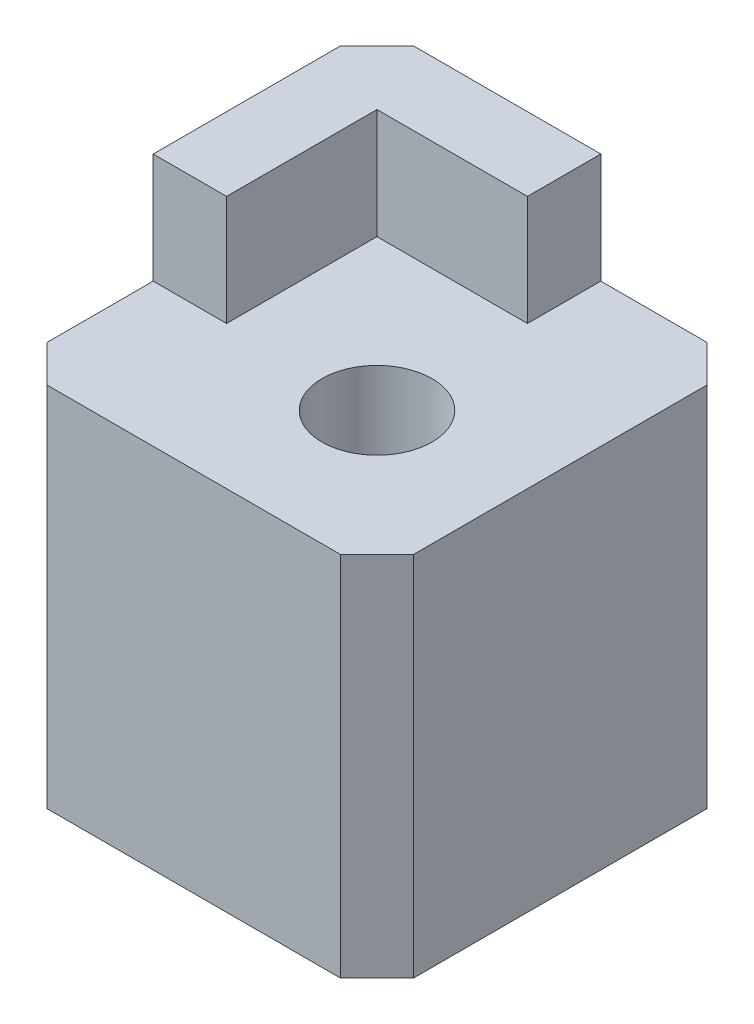
ISO-10303-21;
HEADER;
FILE_DESCRIPTION(('STEP AP214'),'2;1');
FILE_NAME('part.step','',(''),(''),'','','');
FILE_SCHEMA(('AUTOMOTIVE_DESIGN { 1 0 10303 214 1 1 1 1 }'));
ENDSEC;
DATA;
#1=APPLICATION_CONTEXT('core data for automotive mechanical design processes');
#2=APPLICATION_PROTOCOL_DEFINITION('international standard','automotive_design',2000,#1);
#3=PRODUCT_CONTEXT('',#1,'mechanical');
#4=PRODUCT('Part','Part','',(#3));
#5=PRODUCT_RELATED_PRODUCT_CATEGORY('part','',(#4));
#6=PRODUCT_DEFINITION_FORMATION('','',#4);
#7=PRODUCT_DEFINITION_CONTEXT('part definition',#1,'design');
#8=PRODUCT_DEFINITION('design','',#6,#7);
#9=PRODUCT_DEFINITION_SHAPE('','',#8);
#10=(LENGTH_UNIT() NAMED_UNIT(*) SI_UNIT(.MILLI.,.METRE.));
#11=(NAMED_UNIT(*) PLANE_ANGLE_UNIT() SI_UNIT($,.RADIAN.));
#12=(NAMED_UNIT(*) SI_UNIT($,.STERADIAN.) SOLID_ANGLE_UNIT());
#13=UNCERTAINTY_MEASURE_WITH_UNIT(LENGTH_MEASURE(1.E-05),#10,'distance_accuracy_value','');
#14=(GEOMETRIC_REPRESENTATION_CONTEXT(3) GLOBAL_UNCERTAINTY_ASSIGNED_CONTEXT((#13)) GLOBAL_UNIT_ASSIGNED_CONTEXT((#10,
#11,#12)) REPRESENTATION_CONTEXT('',''));
#15=CARTESIAN_POINT('',(0.,0.,0.));
#16=DIRECTION('',(0.,0.,1.));
#17=DIRECTION('',(1.,0.,0.));
#18=AXIS2_PLACEMENT_3D('',#15,#16,#17);
#19=CARTESIAN_POINT('',(0.,0.,0.));
#20=DIRECTION('',(0.,1.,0.));
#21=DIRECTION('',(0.,0.,1.));
#22=AXIS2_PLACEMENT_3D('',#19,#20,#21);
#23=PLANE('',#22);
#24=CARTESIAN_POINT('',(0.,0.,0.));
#25=DIRECTION('',(0.,1.,0.));
#26=DIRECTION('',(0.,0.,1.));
#27=AXIS2_PLACEMENT_3D('',#24,#25,#26);
#28=CIRCLE('',#27,1.5);
#29=CARTESIAN_POINT('',(0.,0.,1.5));
#30=VERTEX_POINT('',#29);
#31=EDGE_CURVE('E210',#30,#30,#28,.T.);
#32=ORIENTED_EDGE('',*,*,#31,.F.);
#33=EDGE_LOOP('',(#32));
#34=FACE_BOUND('',#33,.T.);
#35=DIRECTION('',(0.,0.,1.));
#36=VECTOR('',#35,1.);
#37=CARTESIAN_POINT('',(3.9,0.,-6.1));
#38=LINE('',#37,#36);
#39=CARTESIAN_POINT('',(3.9,0.,-5.1));
#40=VERTEX_POINT('',#39);
#41=CARTESIAN_POINT('',(3.9,0.,2.9));
#42=VERTEX_POINT('',#41);
#43=EDGE_CURVE('E270',#40,#42,#38,.T.);
#44=ORIENTED_EDGE('',*,*,#43,.F.);
#45=DIRECTION('',(0.707106781186549,0.,0.707106781186546));
#46=VECTOR('',#45,1.);
#47=CARTESIAN_POINT('',(4.49999999999999,0.,-4.50000000000001));
#48=LINE('',#47,#46);
#49=CARTESIAN_POINT('',(2.89999999999999,0.,-6.1));
#50=VERTEX_POINT('',#49);
#51=EDGE_CURVE('E313',#40,#50,#48,.F.);
#52=ORIENTED_EDGE('',*,*,#51,.T.);
#53=DIRECTION('',(1.,0.,0.));
#54=VECTOR('',#53,1.);
#55=CARTESIAN_POINT('',(-6.1,0.,-6.1));
#56=LINE('',#55,#54);
#57=CARTESIAN_POINT('',(0.,0.,-6.1));
#58=VERTEX_POINT('',#57);
#59=EDGE_CURVE('E252',#58,#50,#56,.T.);
#60=ORIENTED_EDGE('',*,*,#59,.F.);
#61=DIRECTION('',(0.,0.,1.));
#62=VECTOR('',#61,1.);
#63=CARTESIAN_POINT('',(0.,0.,0.));
#64=LINE('',#63,#62);
#65=CARTESIAN_POINT('',(0.,0.,-4.1));
#66=VERTEX_POINT('',#65);
#67=EDGE_CURVE('E190',#58,#66,#64,.T.);
#68=ORIENTED_EDGE('',*,*,#67,.T.);
#69=DIRECTION('',(-1.,0.,0.));
#70=VECTOR('',#69,1.);
#71=CARTESIAN_POINT('',(0.,0.,-4.1));
#72=LINE('',#71,#70);
#73=CARTESIAN_POINT('',(-4.1,0.,-4.1));
#74=VERTEX_POINT('',#73);
#75=EDGE_CURVE('E201',#66,#74,#72,.T.);
#76=ORIENTED_EDGE('',*,*,#75,.T.);
#77=DIRECTION('',(0.,0.,1.));
#78=VECTOR('',#77,1.);
#79=CARTESIAN_POINT('',(-4.1,0.,0.));
#80=LINE('',#79,#78);
#81=CARTESIAN_POINT('',(-4.1,0.,0.));
#82=VERTEX_POINT('',#81);
#83=EDGE_CURVE('E207',#74,#82,#80,.T.);
#84=ORIENTED_EDGE('',*,*,#83,.T.);
#85=DIRECTION('',(-1.,0.,0.));
#86=VECTOR('',#85,1.);
#87=CARTESIAN_POINT('',(0.,0.,0.));
#88=LINE('',#87,#86);
#89=CARTESIAN_POINT('',(-6.1,0.,0.));
#90=VERTEX_POINT('',#89);
#91=EDGE_CURVE('E229',#82,#90,#88,.T.);
#92=ORIENTED_EDGE('',*,*,#91,.T.);
#93=DIRECTION('',(0.,0.,1.));
#94=VECTOR('',#93,1.);
#95=CARTESIAN_POINT('',(-6.1,0.,-6.1));
#96=LINE('',#95,#94);
#97=CARTESIAN_POINT('',(-6.1,0.,2.9));
#98=VERTEX_POINT('',#97);
#99=EDGE_CURVE('E193',#90,#98,#96,.T.);
#100=ORIENTED_EDGE('',*,*,#99,.T.);
#101=DIRECTION('',(-0.707106781186549,0.,-0.707106781186546));
#102=VECTOR('',#101,1.);
#103=CARTESIAN_POINT('',(-4.49999999999999,0.,4.5));
#104=LINE('',#103,#102);
#105=CARTESIAN_POINT('',(-5.09999999999999,0.,3.9));
#106=VERTEX_POINT('',#105);
#107=EDGE_CURVE('E86',#98,#106,#104,.F.);
#108=ORIENTED_EDGE('',*,*,#107,.T.);
#109=DIRECTION('',(1.,0.,0.));
#110=VECTOR('',#109,1.);
#111=CARTESIAN_POINT('',(-6.1,0.,3.9));
#112=LINE('',#111,#110);
#113=CARTESIAN_POINT('',(2.9,0.,3.9));
#114=VERTEX_POINT('',#113);
#115=EDGE_CURVE('E267',#106,#114,#112,.T.);
#116=ORIENTED_EDGE('',*,*,#115,.T.);
#117=DIRECTION('',(0.707106781186546,0.,-0.707106781186549));
#118=VECTOR('',#117,1.);
#119=CARTESIAN_POINT('',(3.40000000000001,0.,3.39999999999999));
#120=LINE('',#119,#118);
#121=EDGE_CURVE('E75',#114,#42,#120,.T.);
#122=ORIENTED_EDGE('',*,*,#121,.T.);
#123=EDGE_LOOP('',(#44,#52,#60,#68,#76,#84,#92,#100,#108,#116,#122));
#124=FACE_BOUND('',#123,.T.);
#125=ADVANCED_FACE('F56',(#34,#124),#23,.T.);
#126=CARTESIAN_POINT('',(-6.1,-10.,-6.1));
#127=DIRECTION('',(-1.,0.,0.));
#128=DIRECTION('',(0.,0.,1.));
#129=AXIS2_PLACEMENT_3D('',#126,#127,#128);
#130=PLANE('',#129);
#131=DIRECTION('',(0.,0.,-1.));
#132=VECTOR('',#131,1.);
#133=CARTESIAN_POINT('',(-6.1,3.,0.));
#134=LINE('',#133,#132);
#135=CARTESIAN_POINT('',(-6.1,3.,0.));
#136=VERTEX_POINT('',#135);
#137=CARTESIAN_POINT('',(-6.1,3.,-5.09999999999999));
#138=VERTEX_POINT('',#137);
#139=EDGE_CURVE('E182',#136,#138,#134,.T.);
#140=ORIENTED_EDGE('',*,*,#139,.T.);
#141=DIRECTION('',(0.,-1.,0.));
#142=VECTOR('',#141,1.);
#143=CARTESIAN_POINT('',(-6.1,-10.,-5.09999999999999));
#144=LINE('',#143,#142);
#145=CARTESIAN_POINT('',(-6.1,-10.,-5.09999999999999));
#146=VERTEX_POINT('',#145);
#147=EDGE_CURVE('E287',#138,#146,#144,.T.);
#148=ORIENTED_EDGE('',*,*,#147,.T.);
#149=DIRECTION('',(0.,0.,1.));
#150=VECTOR('',#149,1.);
#151=CARTESIAN_POINT('',(-6.1,-10.,-6.1));
#152=LINE('',#151,#150);
#153=CARTESIAN_POINT('',(-6.1,-10.,2.9));
#154=VERTEX_POINT('',#153);
#155=EDGE_CURVE('E247',#146,#154,#152,.T.);
#156=ORIENTED_EDGE('',*,*,#155,.T.);
#157=DIRECTION('',(0.,1.,0.));
#158=VECTOR('',#157,1.);
#159=CARTESIAN_POINT('',(-6.1,-10.,2.9));
#160=LINE('',#159,#158);
#161=EDGE_CURVE('E283',#154,#98,#160,.T.);
#162=ORIENTED_EDGE('',*,*,#161,.T.);
#163=ORIENTED_EDGE('',*,*,#99,.F.);
#164=DIRECTION('',(0.,-1.,0.));
#165=VECTOR('',#164,1.);
#166=CARTESIAN_POINT('',(-6.1,3.,0.));
#167=LINE('',#166,#165);
#168=EDGE_CURVE('E194',#136,#90,#167,.T.);
#169=ORIENTED_EDGE('',*,*,#168,.F.);
#170=EDGE_LOOP('',(#140,#148,#156,#162,#163,#169));
#171=FACE_BOUND('',#170,.T.);
#172=ADVANCED_FACE('F343',(#171),#130,.T.);
#173=CARTESIAN_POINT('',(-6.1,-10.,-6.1));
#174=DIRECTION('',(0.,0.,1.));
#175=DIRECTION('',(1.,0.,0.));
#176=AXIS2_PLACEMENT_3D('',#173,#174,#175);
#177=PLANE('',#176);
#178=DIRECTION('',(1.,0.,0.));
#179=VECTOR('',#178,1.);
#180=CARTESIAN_POINT('',(-6.1,-10.,-6.1));
#181=LINE('',#180,#179);
#182=CARTESIAN_POINT('',(-5.1,-10.,-6.1));
#183=VERTEX_POINT('',#182);
#184=CARTESIAN_POINT('',(2.89999999999999,-10.,-6.1));
#185=VERTEX_POINT('',#184);
#186=EDGE_CURVE('E260',#183,#185,#181,.T.);
#187=ORIENTED_EDGE('',*,*,#186,.F.);
#188=DIRECTION('',(0.,1.,0.));
#189=VECTOR('',#188,1.);
#190=CARTESIAN_POINT('',(-5.1,3.,-6.1));
#191=LINE('',#190,#189);
#192=CARTESIAN_POINT('',(-5.1,3.,-6.1));
#193=VERTEX_POINT('',#192);
#194=EDGE_CURVE('E178',#183,#193,#191,.T.);
#195=ORIENTED_EDGE('',*,*,#194,.T.);
#196=DIRECTION('',(1.,0.,0.));
#197=VECTOR('',#196,1.);
#198=CARTESIAN_POINT('',(0.,3.,-6.1));
#199=LINE('',#198,#197);
#200=CARTESIAN_POINT('',(0.,3.,-6.1));
#201=VERTEX_POINT('',#200);
#202=EDGE_CURVE('E170',#193,#201,#199,.T.);
#203=ORIENTED_EDGE('',*,*,#202,.T.);
#204=DIRECTION('',(0.,-1.,0.));
#205=VECTOR('',#204,1.);
#206=CARTESIAN_POINT('',(0.,3.,-6.1));
#207=LINE('',#206,#205);
#208=EDGE_CURVE('E175',#201,#58,#207,.T.);
#209=ORIENTED_EDGE('',*,*,#208,.T.);
#210=ORIENTED_EDGE('',*,*,#59,.T.);
#211=DIRECTION('',(0.,-1.,0.));
#212=VECTOR('',#211,1.);
#213=CARTESIAN_POINT('',(2.89999999999999,-10.,-6.1));
#214=LINE('',#213,#212);
#215=EDGE_CURVE('E264',#50,#185,#214,.T.);
#216=ORIENTED_EDGE('',*,*,#215,.T.);
#217=EDGE_LOOP('',(#187,#195,#203,#209,#210,#216));
#218=FACE_BOUND('',#217,.T.);
#219=ADVANCED_FACE('F173',(#218),#177,.F.);
#220=CARTESIAN_POINT('',(3.9,-10.,-6.1));
#221=DIRECTION('',(-1.,0.,0.));
#222=DIRECTION('',(0.,0.,1.));
#223=AXIS2_PLACEMENT_3D('',#220,#221,#222);
#224=PLANE('',#223);
#225=DIRECTION('',(0.,0.,1.));
#226=VECTOR('',#225,1.);
#227=CARTESIAN_POINT('',(3.9,-10.,-6.1));
#228=LINE('',#227,#226);
#229=CARTESIAN_POINT('',(3.9,-10.,-5.1));
#230=VERTEX_POINT('',#229);
#231=CARTESIAN_POINT('',(3.9,-10.,2.9));
#232=VERTEX_POINT('',#231);
#233=EDGE_CURVE('E256',#230,#232,#228,.T.);
#234=ORIENTED_EDGE('',*,*,#233,.F.);
#235=DIRECTION('',(0.,1.,0.));
#236=VECTOR('',#235,1.);
#237=CARTESIAN_POINT('',(3.9,-10.,-5.1));
#238=LINE('',#237,#236);
#239=EDGE_CURVE('E305',#230,#40,#238,.T.);
#240=ORIENTED_EDGE('',*,*,#239,.T.);
#241=ORIENTED_EDGE('',*,*,#43,.T.);
#242=DIRECTION('',(0.,-1.,0.));
#243=VECTOR('',#242,1.);
#244=CARTESIAN_POINT('',(3.9,-10.,2.9));
#245=LINE('',#244,#243);
#246=EDGE_CURVE('E302',#42,#232,#245,.T.);
#247=ORIENTED_EDGE('',*,*,#246,.T.);
#248=EDGE_LOOP('',(#234,#240,#241,#247));
#249=FACE_BOUND('',#248,.T.);
#250=ADVANCED_FACE('F326',(#249),#224,.F.);
#251=CARTESIAN_POINT('',(-6.1,-10.,3.9));
#252=DIRECTION('',(0.,0.,1.));
#253=DIRECTION('',(1.,0.,0.));
#254=AXIS2_PLACEMENT_3D('',#251,#252,#253);
#255=PLANE('',#254);
#256=ORIENTED_EDGE('',*,*,#115,.F.);
#257=DIRECTION('',(0.,-1.,0.));
#258=VECTOR('',#257,1.);
#259=CARTESIAN_POINT('',(-5.09999999999999,-10.,3.9));
#260=LINE('',#259,#258);
#261=CARTESIAN_POINT('',(-5.09999999999999,-10.,3.9));
#262=VERTEX_POINT('',#261);
#263=EDGE_CURVE('E11',#106,#262,#260,.T.);
#264=ORIENTED_EDGE('',*,*,#263,.T.);
#265=DIRECTION('',(1.,0.,0.));
#266=VECTOR('',#265,1.);
#267=CARTESIAN_POINT('',(-6.1,-10.,3.9));
#268=LINE('',#267,#266);
#269=CARTESIAN_POINT('',(2.9,-10.,3.9));
#270=VERTEX_POINT('',#269);
#271=EDGE_CURVE('E251',#262,#270,#268,.T.);
#272=ORIENTED_EDGE('',*,*,#271,.T.);
#273=DIRECTION('',(0.,1.,0.));
#274=VECTOR('',#273,1.);
#275=CARTESIAN_POINT('',(2.9,0.,3.9));
#276=LINE('',#275,#274);
#277=EDGE_CURVE('E66',#270,#114,#276,.T.);
#278=ORIENTED_EDGE('',*,*,#277,.T.);
#279=EDGE_LOOP('',(#256,#264,#272,#278));
#280=FACE_BOUND('',#279,.T.);
#281=ADVANCED_FACE('F319',(#280),#255,.T.);
#282=CARTESIAN_POINT('',(0.,-10.,0.));
#283=DIRECTION('',(0.,1.,0.));
#284=DIRECTION('',(0.,0.,1.));
#285=AXIS2_PLACEMENT_3D('',#282,#283,#284);
#286=PLANE('',#285);
#287=CARTESIAN_POINT('',(0.,-10.,0.));
#288=DIRECTION('',(0.,1.,0.));
#289=DIRECTION('',(0.,0.,1.));
#290=AXIS2_PLACEMENT_3D('',#287,#288,#289);
#291=CIRCLE('',#290,1.5);
#292=CARTESIAN_POINT('',(0.,-10.,1.5));
#293=VERTEX_POINT('',#292);
#294=EDGE_CURVE('E230',#293,#293,#291,.T.);
#295=ORIENTED_EDGE('',*,*,#294,.T.);
#296=EDGE_LOOP('',(#295));
#297=FACE_BOUND('',#296,.T.);
#298=ORIENTED_EDGE('',*,*,#155,.F.);
#299=DIRECTION('',(0.707106781186546,0.,-0.707106781186549));
#300=VECTOR('',#299,1.);
#301=CARTESIAN_POINT('',(-5.1,-10.,-6.1));
#302=LINE('',#301,#300);
#303=EDGE_CURVE('E299',#146,#183,#302,.T.);
#304=ORIENTED_EDGE('',*,*,#303,.T.);
#305=ORIENTED_EDGE('',*,*,#186,.T.);
#306=DIRECTION('',(-0.707106781186549,0.,-0.707106781186546));
#307=VECTOR('',#306,1.);
#308=CARTESIAN_POINT('',(3.9,-10.,-5.1));
#309=LINE('',#308,#307);
#310=EDGE_CURVE('E296',#185,#230,#309,.F.);
#311=ORIENTED_EDGE('',*,*,#310,.T.);
#312=ORIENTED_EDGE('',*,*,#233,.T.);
#313=DIRECTION('',(-0.707106781186546,0.,0.707106781186549));
#314=VECTOR('',#313,1.);
#315=CARTESIAN_POINT('',(2.9,-10.,3.9));
#316=LINE('',#315,#314);
#317=EDGE_CURVE('E290',#232,#270,#316,.T.);
#318=ORIENTED_EDGE('',*,*,#317,.T.);
#319=ORIENTED_EDGE('',*,*,#271,.F.);
#320=DIRECTION('',(0.707106781186549,0.,0.707106781186546));
#321=VECTOR('',#320,1.);
#322=CARTESIAN_POINT('',(-6.1,-10.,2.9));
#323=LINE('',#322,#321);
#324=EDGE_CURVE('E293',#262,#154,#323,.F.);
#325=ORIENTED_EDGE('',*,*,#324,.T.);
#326=EDGE_LOOP('',(#298,#304,#305,#311,#312,#318,#319,#325));
#327=FACE_BOUND('',#326,.T.);
#328=ADVANCED_FACE('F330',(#297,#327),#286,.F.);
#329=CARTESIAN_POINT('',(0.,3.,0.));
#330=DIRECTION('',(1.,0.,0.));
#331=DIRECTION('',(0.,0.,-1.));
#332=AXIS2_PLACEMENT_3D('',#329,#330,#331);
#333=PLANE('',#332);
#334=ORIENTED_EDGE('',*,*,#67,.F.);
#335=ORIENTED_EDGE('',*,*,#208,.F.);
#336=DIRECTION('',(0.,0.,1.));
#337=VECTOR('',#336,1.);
#338=CARTESIAN_POINT('',(0.,3.,0.));
#339=LINE('',#338,#337);
#340=CARTESIAN_POINT('',(0.,3.,-4.1));
#341=VERTEX_POINT('',#340);
#342=EDGE_CURVE('E183',#201,#341,#339,.T.);
#343=ORIENTED_EDGE('',*,*,#342,.T.);
#344=DIRECTION('',(0.,-1.,0.));
#345=VECTOR('',#344,1.);
#346=CARTESIAN_POINT('',(0.,3.,-4.1));
#347=LINE('',#346,#345);
#348=EDGE_CURVE('E226',#341,#66,#347,.T.);
#349=ORIENTED_EDGE('',*,*,#348,.T.);
#350=EDGE_LOOP('',(#334,#335,#343,#349));
#351=FACE_BOUND('',#350,.T.);
#352=ADVANCED_FACE('F187',(#351),#333,.T.);
#353=CARTESIAN_POINT('',(0.,3.,0.));
#354=DIRECTION('',(0.,0.,1.));
#355=DIRECTION('',(1.,0.,0.));
#356=AXIS2_PLACEMENT_3D('',#353,#354,#355);
#357=PLANE('',#356);
#358=ORIENTED_EDGE('',*,*,#91,.F.);
#359=DIRECTION('',(0.,-1.,0.));
#360=VECTOR('',#359,1.);
#361=CARTESIAN_POINT('',(-4.1,3.,0.));
#362=LINE('',#361,#360);
#363=CARTESIAN_POINT('',(-4.1,3.,0.));
#364=VERTEX_POINT('',#363);
#365=EDGE_CURVE('E242',#364,#82,#362,.T.);
#366=ORIENTED_EDGE('',*,*,#365,.F.);
#367=DIRECTION('',(-1.,0.,0.));
#368=VECTOR('',#367,1.);
#369=CARTESIAN_POINT('',(0.,3.,0.));
#370=LINE('',#369,#368);
#371=EDGE_CURVE('E216',#364,#136,#370,.T.);
#372=ORIENTED_EDGE('',*,*,#371,.T.);
#373=ORIENTED_EDGE('',*,*,#168,.T.);
#374=EDGE_LOOP('',(#358,#366,#372,#373));
#375=FACE_BOUND('',#374,.T.);
#376=ADVANCED_FACE('F347',(#375),#357,.T.);
#377=CARTESIAN_POINT('',(-4.1,3.,0.));
#378=DIRECTION('',(1.,0.,0.));
#379=DIRECTION('',(0.,0.,-1.));
#380=AXIS2_PLACEMENT_3D('',#377,#378,#379);
#381=PLANE('',#380);
#382=ORIENTED_EDGE('',*,*,#83,.F.);
#383=DIRECTION('',(0.,-1.,0.));
#384=VECTOR('',#383,1.);
#385=CARTESIAN_POINT('',(-4.1,3.,-4.1));
#386=LINE('',#385,#384);
#387=CARTESIAN_POINT('',(-4.1,3.,-4.1));
#388=VERTEX_POINT('',#387);
#389=EDGE_CURVE('E239',#388,#74,#386,.T.);
#390=ORIENTED_EDGE('',*,*,#389,.F.);
#391=DIRECTION('',(0.,0.,1.));
#392=VECTOR('',#391,1.);
#393=CARTESIAN_POINT('',(-4.1,3.,0.));
#394=LINE('',#393,#392);
#395=EDGE_CURVE('E220',#388,#364,#394,.T.);
#396=ORIENTED_EDGE('',*,*,#395,.T.);
#397=ORIENTED_EDGE('',*,*,#365,.T.);
#398=EDGE_LOOP('',(#382,#390,#396,#397));
#399=FACE_BOUND('',#398,.T.);
#400=ADVANCED_FACE('F351',(#399),#381,.T.);
#401=CARTESIAN_POINT('',(0.,3.,-4.1));
#402=DIRECTION('',(0.,0.,1.));
#403=DIRECTION('',(1.,0.,0.));
#404=AXIS2_PLACEMENT_3D('',#401,#402,#403);
#405=PLANE('',#404);
#406=ORIENTED_EDGE('',*,*,#75,.F.);
#407=ORIENTED_EDGE('',*,*,#348,.F.);
#408=DIRECTION('',(-1.,0.,0.));
#409=VECTOR('',#408,1.);
#410=CARTESIAN_POINT('',(0.,3.,-4.1));
#411=LINE('',#410,#409);
#412=EDGE_CURVE('E199',#341,#388,#411,.T.);
#413=ORIENTED_EDGE('',*,*,#412,.T.);
#414=ORIENTED_EDGE('',*,*,#389,.T.);
#415=EDGE_LOOP('',(#406,#407,#413,#414));
#416=FACE_BOUND('',#415,.T.);
#417=ADVANCED_FACE('F353',(#416),#405,.T.);
#418=CARTESIAN_POINT('',(0.,3.,0.));
#419=DIRECTION('',(0.,1.,0.));
#420=DIRECTION('',(0.,0.,1.));
#421=AXIS2_PLACEMENT_3D('',#418,#419,#420);
#422=PLANE('',#421);
#423=ORIENTED_EDGE('',*,*,#202,.F.);
#424=DIRECTION('',(-0.707106781186546,0.,0.707106781186549));
#425=VECTOR('',#424,1.);
#426=CARTESIAN_POINT('',(-5.60000000000001,3.,-5.59999999999998));
#427=LINE('',#426,#425);
#428=EDGE_CURVE('E280',#193,#138,#427,.T.);
#429=ORIENTED_EDGE('',*,*,#428,.T.);
#430=ORIENTED_EDGE('',*,*,#139,.F.);
#431=ORIENTED_EDGE('',*,*,#371,.F.);
#432=ORIENTED_EDGE('',*,*,#395,.F.);
#433=ORIENTED_EDGE('',*,*,#412,.F.);
#434=ORIENTED_EDGE('',*,*,#342,.F.);
#435=EDGE_LOOP('',(#423,#429,#430,#431,#432,#433,#434));
#436=FACE_BOUND('',#435,.T.);
#437=ADVANCED_FACE('F196',(#436),#422,.T.);
#438=CARTESIAN_POINT('',(-5.1,-10.,-6.1));
#439=DIRECTION('',(-0.707106781186549,0.,-0.707106781186546));
#440=DIRECTION('',(0.,-1.,0.));
#441=AXIS2_PLACEMENT_3D('',#438,#439,#440);
#442=PLANE('',#441);
#443=ORIENTED_EDGE('',*,*,#303,.F.);
#444=ORIENTED_EDGE('',*,*,#147,.F.);
#445=ORIENTED_EDGE('',*,*,#428,.F.);
#446=ORIENTED_EDGE('',*,*,#194,.F.);
#447=EDGE_LOOP('',(#443,#444,#445,#446));
#448=FACE_BOUND('',#447,.T.);
#449=ADVANCED_FACE('F339',(#448),#442,.T.);
#450=CARTESIAN_POINT('',(3.9,-10.,-5.1));
#451=DIRECTION('',(-0.707106781186547,0.,0.707106781186549));
#452=DIRECTION('',(0.,1.,0.));
#453=AXIS2_PLACEMENT_3D('',#450,#451,#452);
#454=PLANE('',#453);
#455=ORIENTED_EDGE('',*,*,#310,.F.);
#456=ORIENTED_EDGE('',*,*,#215,.F.);
#457=ORIENTED_EDGE('',*,*,#51,.F.);
#458=ORIENTED_EDGE('',*,*,#239,.F.);
#459=EDGE_LOOP('',(#455,#456,#457,#458));
#460=FACE_BOUND('',#459,.T.);
#461=ADVANCED_FACE('F334',(#460),#454,.F.);
#462=CARTESIAN_POINT('',(-6.1,-10.,2.9));
#463=DIRECTION('',(0.707106781186546,0.,-0.707106781186549));
#464=DIRECTION('',(0.,1.,0.));
#465=AXIS2_PLACEMENT_3D('',#462,#463,#464);
#466=PLANE('',#465);
#467=ORIENTED_EDGE('',*,*,#324,.F.);
#468=ORIENTED_EDGE('',*,*,#263,.F.);
#469=ORIENTED_EDGE('',*,*,#107,.F.);
#470=ORIENTED_EDGE('',*,*,#161,.F.);
#471=EDGE_LOOP('',(#467,#468,#469,#470));
#472=FACE_BOUND('',#471,.T.);
#473=ADVANCED_FACE('F389',(#472),#466,.F.);
#474=CARTESIAN_POINT('',(2.9,-10.,3.9));
#475=DIRECTION('',(0.707106781186549,0.,0.707106781186546));
#476=DIRECTION('',(0.,-1.,0.));
#477=AXIS2_PLACEMENT_3D('',#474,#475,#476);
#478=PLANE('',#477);
#479=ORIENTED_EDGE('',*,*,#317,.F.);
#480=ORIENTED_EDGE('',*,*,#246,.F.);
#481=ORIENTED_EDGE('',*,*,#121,.F.);
#482=ORIENTED_EDGE('',*,*,#277,.F.);
#483=EDGE_LOOP('',(#479,#480,#481,#482));
#484=FACE_BOUND('',#483,.T.);
#485=ADVANCED_FACE('F59',(#484),#478,.T.);
#486=CARTESIAN_POINT('',(0.,-10.,0.));
#487=DIRECTION('',(0.,1.,0.));
#488=DIRECTION('',(0.,0.,1.));
#489=AXIS2_PLACEMENT_3D('',#486,#487,#488);
#490=CYLINDRICAL_SURFACE('',#489,1.5);
#491=ORIENTED_EDGE('',*,*,#294,.F.);
#492=EDGE_LOOP('',(#491));
#493=FACE_BOUND('',#492,.T.);
#494=ORIENTED_EDGE('',*,*,#31,.T.);
#495=EDGE_LOOP('',(#494));
#496=FACE_BOUND('',#495,.T.);
#497=ADVANCED_FACE('F397',(#493,#496),#490,.F.);
#498=CLOSED_SHELL('',(#125,#172,#219,#250,#281,#328,#352,#376,#400,#417,#437,#449,#461,#473,
#485,#497));
#499=MANIFOLD_SOLID_BREP('B2',#498);
#500=ADVANCED_BREP_SHAPE_REPRESENTATION('',(#18,#499),#14);
#501=SHAPE_DEFINITION_REPRESENTATION(#9,#500);
ENDSEC;
END-ISO-10303-21;
